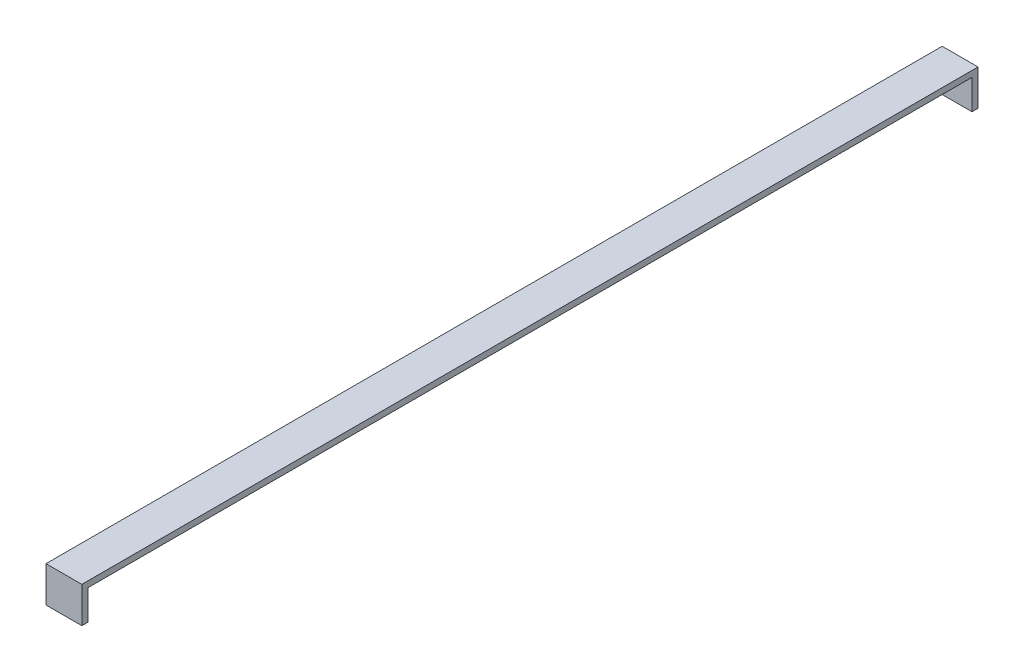
ISO-10303-21;
HEADER;
FILE_DESCRIPTION(('STEP AP214'),'2;1');
FILE_NAME('part.step','',(''),(''),'','','');
FILE_SCHEMA(('AUTOMOTIVE_DESIGN { 1 0 10303 214 1 1 1 1 }'));
ENDSEC;
DATA;
#1=APPLICATION_CONTEXT('core data for automotive mechanical design processes');
#2=APPLICATION_PROTOCOL_DEFINITION('international standard','automotive_design',2000,#1);
#3=PRODUCT_CONTEXT('',#1,'mechanical');
#4=PRODUCT('Part','Part','',(#3));
#5=PRODUCT_RELATED_PRODUCT_CATEGORY('part','',(#4));
#6=PRODUCT_DEFINITION_FORMATION('','',#4);
#7=PRODUCT_DEFINITION_CONTEXT('part definition',#1,'design');
#8=PRODUCT_DEFINITION('design','',#6,#7);
#9=PRODUCT_DEFINITION_SHAPE('','',#8);
#10=(LENGTH_UNIT() NAMED_UNIT(*) SI_UNIT(.MILLI.,.METRE.));
#11=(NAMED_UNIT(*) PLANE_ANGLE_UNIT() SI_UNIT($,.RADIAN.));
#12=(NAMED_UNIT(*) SI_UNIT($,.STERADIAN.) SOLID_ANGLE_UNIT());
#13=UNCERTAINTY_MEASURE_WITH_UNIT(LENGTH_MEASURE(1.E-05),#10,'distance_accuracy_value','');
#14=(GEOMETRIC_REPRESENTATION_CONTEXT(3) GLOBAL_UNCERTAINTY_ASSIGNED_CONTEXT((#13)) GLOBAL_UNIT_ASSIGNED_CONTEXT((#10,
#11,#12)) REPRESENTATION_CONTEXT('',''));
#15=CARTESIAN_POINT('',(0.,0.,0.));
#16=DIRECTION('',(0.,0.,1.));
#17=DIRECTION('',(1.,0.,0.));
#18=AXIS2_PLACEMENT_3D('',#15,#16,#17);
#19=CARTESIAN_POINT('',(6.,20.5709548933768,67.6290963211228));
#20=DIRECTION('',(0.,0.,-1.));
#21=DIRECTION('',(-1.,0.,0.));
#22=AXIS2_PLACEMENT_3D('',#19,#20,#21);
#23=PLANE('',#22);
#24=DIRECTION('',(0.,-1.,0.));
#25=VECTOR('',#24,1.);
#26=CARTESIAN_POINT('',(0.,20.5709548933768,67.6290963211228));
#27=LINE('',#26,#25);
#28=CARTESIAN_POINT('',(0.,20.5709548933768,67.6290963211228));
#29=VERTEX_POINT('',#28);
#30=CARTESIAN_POINT('',(0.,14.5709548933768,67.6290963211228));
#31=VERTEX_POINT('',#30);
#32=EDGE_CURVE('E142',#29,#31,#27,.T.);
#33=ORIENTED_EDGE('',*,*,#32,.T.);
#34=DIRECTION('',(-1.,0.,0.));
#35=VECTOR('',#34,1.);
#36=CARTESIAN_POINT('',(6.,14.5709548933768,67.6290963211228));
#37=LINE('',#36,#35);
#38=CARTESIAN_POINT('',(6.,14.5709548933768,67.6290963211228));
#39=VERTEX_POINT('',#38);
#40=EDGE_CURVE('E11',#39,#31,#37,.T.);
#41=ORIENTED_EDGE('',*,*,#40,.F.);
#42=DIRECTION('',(0.,-1.,0.));
#43=VECTOR('',#42,1.);
#44=CARTESIAN_POINT('',(6.,20.5709548933768,67.6290963211228));
#45=LINE('',#44,#43);
#46=CARTESIAN_POINT('',(6.,20.5709548933768,67.6290963211228));
#47=VERTEX_POINT('',#46);
#48=EDGE_CURVE('E164',#47,#39,#45,.T.);
#49=ORIENTED_EDGE('',*,*,#48,.F.);
#50=DIRECTION('',(-1.,0.,0.));
#51=VECTOR('',#50,1.);
#52=CARTESIAN_POINT('',(6.,20.5709548933768,67.6290963211228));
#53=LINE('',#52,#51);
#54=EDGE_CURVE('E138',#47,#29,#53,.T.);
#55=ORIENTED_EDGE('',*,*,#54,.T.);
#56=EDGE_LOOP('',(#33,#41,#49,#55));
#57=FACE_BOUND('',#56,.T.);
#58=ADVANCED_FACE('F41',(#57),#23,.F.);
#59=CARTESIAN_POINT('',(6.,14.5709548933768,67.6290963211228));
#60=DIRECTION('',(0.,1.,0.));
#61=DIRECTION('',(0.,0.,1.));
#62=AXIS2_PLACEMENT_3D('',#59,#60,#61);
#63=PLANE('',#62);
#64=DIRECTION('',(0.,0.,-1.));
#65=VECTOR('',#64,1.);
#66=CARTESIAN_POINT('',(0.,14.5709548933768,67.6290963211228));
#67=LINE('',#66,#65);
#68=CARTESIAN_POINT('',(0.,14.5709548933768,66.6290963211228));
#69=VERTEX_POINT('',#68);
#70=EDGE_CURVE('E146',#31,#69,#67,.T.);
#71=ORIENTED_EDGE('',*,*,#70,.T.);
#72=DIRECTION('',(-1.,0.,0.));
#73=VECTOR('',#72,1.);
#74=CARTESIAN_POINT('',(6.,14.5709548933768,66.6290963211228));
#75=LINE('',#74,#73);
#76=CARTESIAN_POINT('',(6.,14.5709548933768,66.6290963211228));
#77=VERTEX_POINT('',#76);
#78=EDGE_CURVE('E50',#77,#69,#75,.T.);
#79=ORIENTED_EDGE('',*,*,#78,.F.);
#80=DIRECTION('',(0.,0.,-1.));
#81=VECTOR('',#80,1.);
#82=CARTESIAN_POINT('',(6.,14.5709548933768,67.6290963211228));
#83=LINE('',#82,#81);
#84=EDGE_CURVE('E101',#39,#77,#83,.T.);
#85=ORIENTED_EDGE('',*,*,#84,.F.);
#86=ORIENTED_EDGE('',*,*,#40,.T.);
#87=EDGE_LOOP('',(#71,#79,#85,#86));
#88=FACE_BOUND('',#87,.T.);
#89=ADVANCED_FACE('F210',(#88),#63,.F.);
#90=CARTESIAN_POINT('',(6.,14.5709548933768,66.6290963211228));
#91=DIRECTION('',(0.,0.,1.));
#92=DIRECTION('',(1.,0.,0.));
#93=AXIS2_PLACEMENT_3D('',#90,#91,#92);
#94=PLANE('',#93);
#95=DIRECTION('',(0.,1.,0.));
#96=VECTOR('',#95,1.);
#97=CARTESIAN_POINT('',(0.,14.5709548933768,66.6290963211228));
#98=LINE('',#97,#96);
#99=CARTESIAN_POINT('',(0.,19.5709548933768,66.6290963211228));
#100=VERTEX_POINT('',#99);
#101=EDGE_CURVE('E149',#69,#100,#98,.T.);
#102=ORIENTED_EDGE('',*,*,#101,.T.);
#103=DIRECTION('',(-1.,0.,0.));
#104=VECTOR('',#103,1.);
#105=CARTESIAN_POINT('',(6.,19.5709548933768,66.6290963211228));
#106=LINE('',#105,#104);
#107=CARTESIAN_POINT('',(6.,19.5709548933768,66.6290963211228));
#108=VERTEX_POINT('',#107);
#109=EDGE_CURVE('E175',#108,#100,#106,.T.);
#110=ORIENTED_EDGE('',*,*,#109,.F.);
#111=DIRECTION('',(0.,1.,0.));
#112=VECTOR('',#111,1.);
#113=CARTESIAN_POINT('',(6.,14.5709548933768,66.6290963211228));
#114=LINE('',#113,#112);
#115=EDGE_CURVE('E185',#77,#108,#114,.T.);
#116=ORIENTED_EDGE('',*,*,#115,.F.);
#117=ORIENTED_EDGE('',*,*,#78,.T.);
#118=EDGE_LOOP('',(#102,#110,#116,#117));
#119=FACE_BOUND('',#118,.T.);
#120=ADVANCED_FACE('F183',(#119),#94,.F.);
#121=CARTESIAN_POINT('',(6.,19.5709548933768,66.6290963211228));
#122=DIRECTION('',(0.,1.,0.));
#123=DIRECTION('',(0.,0.,1.));
#124=AXIS2_PLACEMENT_3D('',#121,#122,#123);
#125=PLANE('',#124);
#126=DIRECTION('',(0.,0.,-1.));
#127=VECTOR('',#126,1.);
#128=CARTESIAN_POINT('',(0.,19.5709548933768,66.6290963211228));
#129=LINE('',#128,#127);
#130=CARTESIAN_POINT('',(0.,19.5709548933768,-81.3709036788771));
#131=VERTEX_POINT('',#130);
#132=EDGE_CURVE('E152',#100,#131,#129,.T.);
#133=ORIENTED_EDGE('',*,*,#132,.T.);
#134=DIRECTION('',(-1.,0.,0.));
#135=VECTOR('',#134,1.);
#136=CARTESIAN_POINT('',(6.,19.5709548933768,-81.3709036788771));
#137=LINE('',#136,#135);
#138=CARTESIAN_POINT('',(6.,19.5709548933768,-81.3709036788771));
#139=VERTEX_POINT('',#138);
#140=EDGE_CURVE('E171',#139,#131,#137,.T.);
#141=ORIENTED_EDGE('',*,*,#140,.F.);
#142=DIRECTION('',(0.,0.,-1.));
#143=VECTOR('',#142,1.);
#144=CARTESIAN_POINT('',(6.,19.5709548933768,66.6290963211228));
#145=LINE('',#144,#143);
#146=EDGE_CURVE('E198',#108,#139,#145,.T.);
#147=ORIENTED_EDGE('',*,*,#146,.F.);
#148=ORIENTED_EDGE('',*,*,#109,.T.);
#149=EDGE_LOOP('',(#133,#141,#147,#148));
#150=FACE_BOUND('',#149,.T.);
#151=ADVANCED_FACE('F193',(#150),#125,.F.);
#152=CARTESIAN_POINT('',(6.,14.5709548933768,-81.3709036788771));
#153=DIRECTION('',(0.,0.,-1.));
#154=DIRECTION('',(-1.,0.,0.));
#155=AXIS2_PLACEMENT_3D('',#152,#153,#154);
#156=PLANE('',#155);
#157=DIRECTION('',(0.,-1.,0.));
#158=VECTOR('',#157,1.);
#159=CARTESIAN_POINT('',(0.,14.5709548933768,-81.3709036788771));
#160=LINE('',#159,#158);
#161=CARTESIAN_POINT('',(0.,14.5709548933768,-81.3709036788771));
#162=VERTEX_POINT('',#161);
#163=EDGE_CURVE('E155',#131,#162,#160,.T.);
#164=ORIENTED_EDGE('',*,*,#163,.T.);
#165=DIRECTION('',(-1.,0.,0.));
#166=VECTOR('',#165,1.);
#167=CARTESIAN_POINT('',(6.,14.5709548933768,-81.3709036788771));
#168=LINE('',#167,#166);
#169=CARTESIAN_POINT('',(6.,14.5709548933768,-81.3709036788771));
#170=VERTEX_POINT('',#169);
#171=EDGE_CURVE('E131',#170,#162,#168,.T.);
#172=ORIENTED_EDGE('',*,*,#171,.F.);
#173=DIRECTION('',(0.,-1.,0.));
#174=VECTOR('',#173,1.);
#175=CARTESIAN_POINT('',(6.,14.5709548933768,-81.3709036788771));
#176=LINE('',#175,#174);
#177=EDGE_CURVE('E120',#139,#170,#176,.T.);
#178=ORIENTED_EDGE('',*,*,#177,.F.);
#179=ORIENTED_EDGE('',*,*,#140,.T.);
#180=EDGE_LOOP('',(#164,#172,#178,#179));
#181=FACE_BOUND('',#180,.T.);
#182=ADVANCED_FACE('F196',(#181),#156,.F.);
#183=CARTESIAN_POINT('',(6.,14.5709548933768,-81.3709036788771));
#184=DIRECTION('',(0.,1.,0.));
#185=DIRECTION('',(0.,0.,1.));
#186=AXIS2_PLACEMENT_3D('',#183,#184,#185);
#187=PLANE('',#186);
#188=DIRECTION('',(0.,0.,-1.));
#189=VECTOR('',#188,1.);
#190=CARTESIAN_POINT('',(0.,14.5709548933768,-81.3709036788771));
#191=LINE('',#190,#189);
#192=CARTESIAN_POINT('',(0.,14.5709548933768,-82.3709036788771));
#193=VERTEX_POINT('',#192);
#194=EDGE_CURVE('E129',#162,#193,#191,.T.);
#195=ORIENTED_EDGE('',*,*,#194,.T.);
#196=DIRECTION('',(-1.,0.,0.));
#197=VECTOR('',#196,1.);
#198=CARTESIAN_POINT('',(6.,14.5709548933768,-82.3709036788771));
#199=LINE('',#198,#197);
#200=CARTESIAN_POINT('',(6.,14.5709548933768,-82.3709036788771));
#201=VERTEX_POINT('',#200);
#202=EDGE_CURVE('E126',#201,#193,#199,.T.);
#203=ORIENTED_EDGE('',*,*,#202,.F.);
#204=DIRECTION('',(0.,0.,-1.));
#205=VECTOR('',#204,1.);
#206=CARTESIAN_POINT('',(6.,14.5709548933768,-81.3709036788771));
#207=LINE('',#206,#205);
#208=EDGE_CURVE('E114',#170,#201,#207,.T.);
#209=ORIENTED_EDGE('',*,*,#208,.F.);
#210=ORIENTED_EDGE('',*,*,#171,.T.);
#211=EDGE_LOOP('',(#195,#203,#209,#210));
#212=FACE_BOUND('',#211,.T.);
#213=ADVANCED_FACE('F127',(#212),#187,.F.);
#214=CARTESIAN_POINT('',(6.,20.5709548933768,-82.3709036788771));
#215=DIRECTION('',(0.,0.,1.));
#216=DIRECTION('',(1.,0.,0.));
#217=AXIS2_PLACEMENT_3D('',#214,#215,#216);
#218=PLANE('',#217);
#219=DIRECTION('',(0.,1.,0.));
#220=VECTOR('',#219,1.);
#221=CARTESIAN_POINT('',(0.,20.5709548933768,-82.3709036788771));
#222=LINE('',#221,#220);
#223=CARTESIAN_POINT('',(0.,20.5709548933768,-82.3709036788771));
#224=VERTEX_POINT('',#223);
#225=EDGE_CURVE('E87',#193,#224,#222,.T.);
#226=ORIENTED_EDGE('',*,*,#225,.T.);
#227=DIRECTION('',(-1.,0.,0.));
#228=VECTOR('',#227,1.);
#229=CARTESIAN_POINT('',(6.,20.5709548933768,-82.3709036788771));
#230=LINE('',#229,#228);
#231=CARTESIAN_POINT('',(6.,20.5709548933768,-82.3709036788771));
#232=VERTEX_POINT('',#231);
#233=EDGE_CURVE('E132',#232,#224,#230,.T.);
#234=ORIENTED_EDGE('',*,*,#233,.F.);
#235=DIRECTION('',(0.,1.,0.));
#236=VECTOR('',#235,1.);
#237=CARTESIAN_POINT('',(6.,20.5709548933768,-82.3709036788771));
#238=LINE('',#237,#236);
#239=EDGE_CURVE('E118',#201,#232,#238,.T.);
#240=ORIENTED_EDGE('',*,*,#239,.F.);
#241=ORIENTED_EDGE('',*,*,#202,.T.);
#242=EDGE_LOOP('',(#226,#234,#240,#241));
#243=FACE_BOUND('',#242,.T.);
#244=ADVANCED_FACE('F134',(#243),#218,.F.);
#245=CARTESIAN_POINT('',(6.,20.5709548933768,67.6290963211228));
#246=DIRECTION('',(0.,-1.,0.));
#247=DIRECTION('',(0.,0.,-1.));
#248=AXIS2_PLACEMENT_3D('',#245,#246,#247);
#249=PLANE('',#248);
#250=DIRECTION('',(0.,0.,1.));
#251=VECTOR('',#250,1.);
#252=CARTESIAN_POINT('',(0.,20.5709548933768,67.6290963211228));
#253=LINE('',#252,#251);
#254=EDGE_CURVE('E93',#224,#29,#253,.T.);
#255=ORIENTED_EDGE('',*,*,#254,.T.);
#256=ORIENTED_EDGE('',*,*,#54,.F.);
#257=DIRECTION('',(0.,0.,1.));
#258=VECTOR('',#257,1.);
#259=CARTESIAN_POINT('',(6.,20.5709548933768,67.6290963211228));
#260=LINE('',#259,#258);
#261=EDGE_CURVE('E58',#232,#47,#260,.T.);
#262=ORIENTED_EDGE('',*,*,#261,.F.);
#263=ORIENTED_EDGE('',*,*,#233,.T.);
#264=EDGE_LOOP('',(#255,#256,#262,#263));
#265=FACE_BOUND('',#264,.T.);
#266=ADVANCED_FACE('F226',(#265),#249,.F.);
#267=CARTESIAN_POINT('',(6.,0.,0.));
#268=DIRECTION('',(1.,0.,0.));
#269=DIRECTION('',(0.,0.,-1.));
#270=AXIS2_PLACEMENT_3D('',#267,#268,#269);
#271=PLANE('',#270);
#272=ORIENTED_EDGE('',*,*,#48,.T.);
#273=ORIENTED_EDGE('',*,*,#84,.T.);
#274=ORIENTED_EDGE('',*,*,#115,.T.);
#275=ORIENTED_EDGE('',*,*,#146,.T.);
#276=ORIENTED_EDGE('',*,*,#177,.T.);
#277=ORIENTED_EDGE('',*,*,#208,.T.);
#278=ORIENTED_EDGE('',*,*,#239,.T.);
#279=ORIENTED_EDGE('',*,*,#261,.T.);
#280=EDGE_LOOP('',(#272,#273,#274,#275,#276,#277,#278,#279));
#281=FACE_BOUND('',#280,.T.);
#282=ADVANCED_FACE('F116',(#281),#271,.T.);
#283=CARTESIAN_POINT('',(0.,0.,0.));
#284=DIRECTION('',(1.,0.,0.));
#285=DIRECTION('',(0.,0.,-1.));
#286=AXIS2_PLACEMENT_3D('',#283,#284,#285);
#287=PLANE('',#286);
#288=ORIENTED_EDGE('',*,*,#32,.F.);
#289=ORIENTED_EDGE('',*,*,#254,.F.);
#290=ORIENTED_EDGE('',*,*,#225,.F.);
#291=ORIENTED_EDGE('',*,*,#194,.F.);
#292=ORIENTED_EDGE('',*,*,#163,.F.);
#293=ORIENTED_EDGE('',*,*,#132,.F.);
#294=ORIENTED_EDGE('',*,*,#101,.F.);
#295=ORIENTED_EDGE('',*,*,#70,.F.);
#296=EDGE_LOOP('',(#288,#289,#290,#291,#292,#293,#294,#295));
#297=FACE_BOUND('',#296,.T.);
#298=ADVANCED_FACE('F189',(#297),#287,.F.);
#299=CLOSED_SHELL('',(#58,#89,#120,#151,#182,#213,#244,#266,#282,#298));
#300=MANIFOLD_SOLID_BREP('B2',#299);
#301=ADVANCED_BREP_SHAPE_REPRESENTATION('',(#18,#300),#14);
#302=SHAPE_DEFINITION_REPRESENTATION(#9,#301);
ENDSEC;
END-ISO-10303-21;
